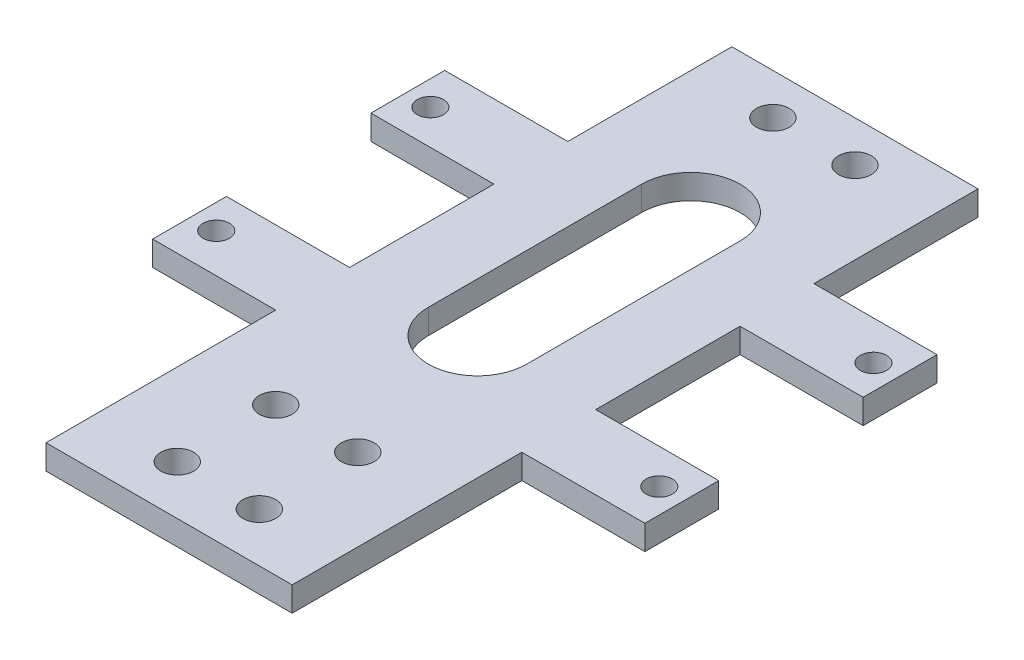
ISO-10303-21;
HEADER;
FILE_DESCRIPTION(('STEP AP214'),'2;1');
FILE_NAME('part.step','',(''),(''),'','','');
FILE_SCHEMA(('AUTOMOTIVE_DESIGN { 1 0 10303 214 1 1 1 1 }'));
ENDSEC;
DATA;
#1=APPLICATION_CONTEXT('core data for automotive mechanical design processes');
#2=APPLICATION_PROTOCOL_DEFINITION('international standard','automotive_design',2000,#1);
#3=PRODUCT_CONTEXT('',#1,'mechanical');
#4=PRODUCT('Part','Part','',(#3));
#5=PRODUCT_RELATED_PRODUCT_CATEGORY('part','',(#4));
#6=PRODUCT_DEFINITION_FORMATION('','',#4);
#7=PRODUCT_DEFINITION_CONTEXT('part definition',#1,'design');
#8=PRODUCT_DEFINITION('design','',#6,#7);
#9=PRODUCT_DEFINITION_SHAPE('','',#8);
#10=(LENGTH_UNIT() NAMED_UNIT(*) SI_UNIT(.MILLI.,.METRE.));
#11=(NAMED_UNIT(*) PLANE_ANGLE_UNIT() SI_UNIT($,.RADIAN.));
#12=(NAMED_UNIT(*) SI_UNIT($,.STERADIAN.) SOLID_ANGLE_UNIT());
#13=UNCERTAINTY_MEASURE_WITH_UNIT(LENGTH_MEASURE(1.E-05),#10,'distance_accuracy_value','');
#14=(GEOMETRIC_REPRESENTATION_CONTEXT(3) GLOBAL_UNCERTAINTY_ASSIGNED_CONTEXT((#13)) GLOBAL_UNIT_ASSIGNED_CONTEXT((#10,
#11,#12)) REPRESENTATION_CONTEXT('',''));
#15=CARTESIAN_POINT('',(0.,0.,0.));
#16=DIRECTION('',(0.,0.,1.));
#17=DIRECTION('',(1.,0.,0.));
#18=AXIS2_PLACEMENT_3D('',#15,#16,#17);
#19=CARTESIAN_POINT('',(0.,3.,0.));
#20=DIRECTION('',(1.,0.,0.));
#21=DIRECTION('',(0.,0.,-1.));
#22=AXIS2_PLACEMENT_3D('',#19,#20,#21);
#23=PLANE('',#22);
#24=DIRECTION('',(0.,0.,1.));
#25=VECTOR('',#24,1.);
#26=CARTESIAN_POINT('',(0.,0.,0.));
#27=LINE('',#26,#25);
#28=CARTESIAN_POINT('',(0.,0.,-9.));
#29=VERTEX_POINT('',#28);
#30=CARTESIAN_POINT('',(0.,0.,0.));
#31=VERTEX_POINT('',#30);
#32=EDGE_CURVE('E289',#29,#31,#27,.T.);
#33=ORIENTED_EDGE('',*,*,#32,.T.);
#34=DIRECTION('',(0.,-1.,0.));
#35=VECTOR('',#34,1.);
#36=CARTESIAN_POINT('',(0.,3.,0.));
#37=LINE('',#36,#35);
#38=CARTESIAN_POINT('',(0.,3.,0.));
#39=VERTEX_POINT('',#38);
#40=EDGE_CURVE('E11',#39,#31,#37,.T.);
#41=ORIENTED_EDGE('',*,*,#40,.F.);
#42=DIRECTION('',(0.,0.,1.));
#43=VECTOR('',#42,1.);
#44=CARTESIAN_POINT('',(0.,3.,0.));
#45=LINE('',#44,#43);
#46=CARTESIAN_POINT('',(0.,3.,-9.));
#47=VERTEX_POINT('',#46);
#48=EDGE_CURVE('E292',#47,#39,#45,.T.);
#49=ORIENTED_EDGE('',*,*,#48,.F.);
#50=DIRECTION('',(0.,-1.,0.));
#51=VECTOR('',#50,1.);
#52=CARTESIAN_POINT('',(0.,3.,-9.));
#53=LINE('',#52,#51);
#54=EDGE_CURVE('E334',#47,#29,#53,.T.);
#55=ORIENTED_EDGE('',*,*,#54,.T.);
#56=EDGE_LOOP('',(#33,#41,#49,#55));
#57=FACE_BOUND('',#56,.T.);
#58=ADVANCED_FACE('F35',(#57),#23,.F.);
#59=CARTESIAN_POINT('',(0.,3.,0.));
#60=DIRECTION('',(0.,0.,-1.));
#61=DIRECTION('',(-1.,0.,0.));
#62=AXIS2_PLACEMENT_3D('',#59,#60,#61);
#63=PLANE('',#62);
#64=DIRECTION('',(1.,0.,0.));
#65=VECTOR('',#64,1.);
#66=CARTESIAN_POINT('',(0.,0.,0.));
#67=LINE('',#66,#65);
#68=CARTESIAN_POINT('',(15.,0.,0.));
#69=VERTEX_POINT('',#68);
#70=EDGE_CURVE('E337',#31,#69,#67,.T.);
#71=ORIENTED_EDGE('',*,*,#70,.T.);
#72=DIRECTION('',(0.,-1.,0.));
#73=VECTOR('',#72,1.);
#74=CARTESIAN_POINT('',(15.,3.,0.));
#75=LINE('',#74,#73);
#76=CARTESIAN_POINT('',(15.,3.,0.));
#77=VERTEX_POINT('',#76);
#78=EDGE_CURVE('E42',#77,#69,#75,.T.);
#79=ORIENTED_EDGE('',*,*,#78,.F.);
#80=DIRECTION('',(1.,0.,0.));
#81=VECTOR('',#80,1.);
#82=CARTESIAN_POINT('',(0.,3.,0.));
#83=LINE('',#82,#81);
#84=EDGE_CURVE('E295',#39,#77,#83,.T.);
#85=ORIENTED_EDGE('',*,*,#84,.F.);
#86=ORIENTED_EDGE('',*,*,#40,.T.);
#87=EDGE_LOOP('',(#71,#79,#85,#86));
#88=FACE_BOUND('',#87,.T.);
#89=ADVANCED_FACE('F453',(#88),#63,.F.);
#90=CARTESIAN_POINT('',(15.,3.,0.));
#91=DIRECTION('',(1.,0.,0.));
#92=DIRECTION('',(0.,0.,-1.));
#93=AXIS2_PLACEMENT_3D('',#90,#91,#92);
#94=PLANE('',#93);
#95=DIRECTION('',(0.,0.,1.));
#96=VECTOR('',#95,1.);
#97=CARTESIAN_POINT('',(15.,0.,0.));
#98=LINE('',#97,#96);
#99=CARTESIAN_POINT('',(15.,0.,28.));
#100=VERTEX_POINT('',#99);
#101=EDGE_CURVE('E339',#69,#100,#98,.T.);
#102=ORIENTED_EDGE('',*,*,#101,.T.);
#103=DIRECTION('',(0.,-1.,0.));
#104=VECTOR('',#103,1.);
#105=CARTESIAN_POINT('',(15.,3.,28.));
#106=LINE('',#105,#104);
#107=CARTESIAN_POINT('',(15.,3.,28.));
#108=VERTEX_POINT('',#107);
#109=EDGE_CURVE('E424',#108,#100,#106,.T.);
#110=ORIENTED_EDGE('',*,*,#109,.F.);
#111=DIRECTION('',(0.,0.,1.));
#112=VECTOR('',#111,1.);
#113=CARTESIAN_POINT('',(15.,3.,0.));
#114=LINE('',#113,#112);
#115=EDGE_CURVE('E298',#77,#108,#114,.T.);
#116=ORIENTED_EDGE('',*,*,#115,.F.);
#117=ORIENTED_EDGE('',*,*,#78,.T.);
#118=EDGE_LOOP('',(#102,#110,#116,#117));
#119=FACE_BOUND('',#118,.T.);
#120=ADVANCED_FACE('F431',(#119),#94,.F.);
#121=CARTESIAN_POINT('',(45.,3.,28.));
#122=DIRECTION('',(0.,0.,-1.));
#123=DIRECTION('',(-1.,0.,0.));
#124=AXIS2_PLACEMENT_3D('',#121,#122,#123);
#125=PLANE('',#124);
#126=DIRECTION('',(1.,0.,0.));
#127=VECTOR('',#126,1.);
#128=CARTESIAN_POINT('',(45.,0.,28.));
#129=LINE('',#128,#127);
#130=CARTESIAN_POINT('',(45.,0.,28.));
#131=VERTEX_POINT('',#130);
#132=EDGE_CURVE('E341',#100,#131,#129,.T.);
#133=ORIENTED_EDGE('',*,*,#132,.T.);
#134=DIRECTION('',(0.,-1.,0.));
#135=VECTOR('',#134,1.);
#136=CARTESIAN_POINT('',(45.,3.,28.));
#137=LINE('',#136,#135);
#138=CARTESIAN_POINT('',(45.,3.,28.));
#139=VERTEX_POINT('',#138);
#140=EDGE_CURVE('E421',#139,#131,#137,.T.);
#141=ORIENTED_EDGE('',*,*,#140,.F.);
#142=DIRECTION('',(1.,0.,0.));
#143=VECTOR('',#142,1.);
#144=CARTESIAN_POINT('',(45.,3.,28.));
#145=LINE('',#144,#143);
#146=EDGE_CURVE('E300',#108,#139,#145,.T.);
#147=ORIENTED_EDGE('',*,*,#146,.F.);
#148=ORIENTED_EDGE('',*,*,#109,.T.);
#149=EDGE_LOOP('',(#133,#141,#147,#148));
#150=FACE_BOUND('',#149,.T.);
#151=ADVANCED_FACE('F441',(#150),#125,.F.);
#152=CARTESIAN_POINT('',(45.,3.,0.));
#153=DIRECTION('',(-1.,0.,0.));
#154=DIRECTION('',(0.,0.,1.));
#155=AXIS2_PLACEMENT_3D('',#152,#153,#154);
#156=PLANE('',#155);
#157=DIRECTION('',(0.,0.,-1.));
#158=VECTOR('',#157,1.);
#159=CARTESIAN_POINT('',(45.,0.,0.));
#160=LINE('',#159,#158);
#161=CARTESIAN_POINT('',(45.,0.,0.));
#162=VERTEX_POINT('',#161);
#163=EDGE_CURVE('E343',#131,#162,#160,.T.);
#164=ORIENTED_EDGE('',*,*,#163,.T.);
#165=DIRECTION('',(0.,-1.,0.));
#166=VECTOR('',#165,1.);
#167=CARTESIAN_POINT('',(45.,3.,0.));
#168=LINE('',#167,#166);
#169=CARTESIAN_POINT('',(45.,3.,0.));
#170=VERTEX_POINT('',#169);
#171=EDGE_CURVE('E418',#170,#162,#168,.T.);
#172=ORIENTED_EDGE('',*,*,#171,.F.);
#173=DIRECTION('',(0.,0.,-1.));
#174=VECTOR('',#173,1.);
#175=CARTESIAN_POINT('',(45.,3.,0.));
#176=LINE('',#175,#174);
#177=EDGE_CURVE('E302',#139,#170,#176,.T.);
#178=ORIENTED_EDGE('',*,*,#177,.F.);
#179=ORIENTED_EDGE('',*,*,#140,.T.);
#180=EDGE_LOOP('',(#164,#172,#178,#179));
#181=FACE_BOUND('',#180,.T.);
#182=ADVANCED_FACE('F445',(#181),#156,.F.);
#183=CARTESIAN_POINT('',(60.,3.,0.));
#184=DIRECTION('',(0.,0.,-1.));
#185=DIRECTION('',(-1.,0.,0.));
#186=AXIS2_PLACEMENT_3D('',#183,#184,#185);
#187=PLANE('',#186);
#188=DIRECTION('',(1.,0.,0.));
#189=VECTOR('',#188,1.);
#190=CARTESIAN_POINT('',(60.,0.,0.));
#191=LINE('',#190,#189);
#192=CARTESIAN_POINT('',(60.,0.,0.));
#193=VERTEX_POINT('',#192);
#194=EDGE_CURVE('E345',#162,#193,#191,.T.);
#195=ORIENTED_EDGE('',*,*,#194,.T.);
#196=DIRECTION('',(0.,-1.,0.));
#197=VECTOR('',#196,1.);
#198=CARTESIAN_POINT('',(60.,3.,0.));
#199=LINE('',#198,#197);
#200=CARTESIAN_POINT('',(60.,3.,0.));
#201=VERTEX_POINT('',#200);
#202=EDGE_CURVE('E415',#201,#193,#199,.T.);
#203=ORIENTED_EDGE('',*,*,#202,.F.);
#204=DIRECTION('',(1.,0.,0.));
#205=VECTOR('',#204,1.);
#206=CARTESIAN_POINT('',(60.,3.,0.));
#207=LINE('',#206,#205);
#208=EDGE_CURVE('E304',#170,#201,#207,.T.);
#209=ORIENTED_EDGE('',*,*,#208,.F.);
#210=ORIENTED_EDGE('',*,*,#171,.T.);
#211=EDGE_LOOP('',(#195,#203,#209,#210));
#212=FACE_BOUND('',#211,.T.);
#213=ADVANCED_FACE('F526',(#212),#187,.F.);
#214=CARTESIAN_POINT('',(60.,3.,-9.));
#215=DIRECTION('',(-1.,0.,0.));
#216=DIRECTION('',(0.,0.,1.));
#217=AXIS2_PLACEMENT_3D('',#214,#215,#216);
#218=PLANE('',#217);
#219=DIRECTION('',(0.,0.,-1.));
#220=VECTOR('',#219,1.);
#221=CARTESIAN_POINT('',(60.,0.,-9.));
#222=LINE('',#221,#220);
#223=CARTESIAN_POINT('',(60.,0.,-9.));
#224=VERTEX_POINT('',#223);
#225=EDGE_CURVE('E347',#193,#224,#222,.T.);
#226=ORIENTED_EDGE('',*,*,#225,.T.);
#227=DIRECTION('',(0.,-1.,0.));
#228=VECTOR('',#227,1.);
#229=CARTESIAN_POINT('',(60.,3.,-9.));
#230=LINE('',#229,#228);
#231=CARTESIAN_POINT('',(60.,3.,-9.));
#232=VERTEX_POINT('',#231);
#233=EDGE_CURVE('E412',#232,#224,#230,.T.);
#234=ORIENTED_EDGE('',*,*,#233,.F.);
#235=DIRECTION('',(0.,0.,-1.));
#236=VECTOR('',#235,1.);
#237=CARTESIAN_POINT('',(60.,3.,-9.));
#238=LINE('',#237,#236);
#239=EDGE_CURVE('E306',#201,#232,#238,.T.);
#240=ORIENTED_EDGE('',*,*,#239,.F.);
#241=ORIENTED_EDGE('',*,*,#202,.T.);
#242=EDGE_LOOP('',(#226,#234,#240,#241));
#243=FACE_BOUND('',#242,.T.);
#244=ADVANCED_FACE('F524',(#243),#218,.F.);
#245=CARTESIAN_POINT('',(45.,3.,-9.));
#246=DIRECTION('',(0.,0.,1.));
#247=DIRECTION('',(1.,0.,0.));
#248=AXIS2_PLACEMENT_3D('',#245,#246,#247);
#249=PLANE('',#248);
#250=DIRECTION('',(-1.,0.,0.));
#251=VECTOR('',#250,1.);
#252=CARTESIAN_POINT('',(45.,0.,-9.));
#253=LINE('',#252,#251);
#254=CARTESIAN_POINT('',(45.,0.,-9.));
#255=VERTEX_POINT('',#254);
#256=EDGE_CURVE('E349',#224,#255,#253,.T.);
#257=ORIENTED_EDGE('',*,*,#256,.T.);
#258=DIRECTION('',(0.,-1.,0.));
#259=VECTOR('',#258,1.);
#260=CARTESIAN_POINT('',(45.,3.,-9.));
#261=LINE('',#260,#259);
#262=CARTESIAN_POINT('',(45.,3.,-9.));
#263=VERTEX_POINT('',#262);
#264=EDGE_CURVE('E409',#263,#255,#261,.T.);
#265=ORIENTED_EDGE('',*,*,#264,.F.);
#266=DIRECTION('',(-1.,0.,0.));
#267=VECTOR('',#266,1.);
#268=CARTESIAN_POINT('',(45.,3.,-9.));
#269=LINE('',#268,#267);
#270=EDGE_CURVE('E308',#232,#263,#269,.T.);
#271=ORIENTED_EDGE('',*,*,#270,.F.);
#272=ORIENTED_EDGE('',*,*,#233,.T.);
#273=EDGE_LOOP('',(#257,#265,#271,#272));
#274=FACE_BOUND('',#273,.T.);
#275=ADVANCED_FACE('F519',(#274),#249,.F.);
#276=CARTESIAN_POINT('',(45.,3.,-26.6));
#277=DIRECTION('',(-1.,0.,0.));
#278=DIRECTION('',(0.,0.,1.));
#279=AXIS2_PLACEMENT_3D('',#276,#277,#278);
#280=PLANE('',#279);
#281=DIRECTION('',(0.,0.,-1.));
#282=VECTOR('',#281,1.);
#283=CARTESIAN_POINT('',(45.,0.,-26.6));
#284=LINE('',#283,#282);
#285=CARTESIAN_POINT('',(45.,0.,-26.6));
#286=VERTEX_POINT('',#285);
#287=EDGE_CURVE('E351',#255,#286,#284,.T.);
#288=ORIENTED_EDGE('',*,*,#287,.T.);
#289=DIRECTION('',(0.,-1.,0.));
#290=VECTOR('',#289,1.);
#291=CARTESIAN_POINT('',(45.,3.,-26.6));
#292=LINE('',#291,#290);
#293=CARTESIAN_POINT('',(45.,3.,-26.6));
#294=VERTEX_POINT('',#293);
#295=EDGE_CURVE('E406',#294,#286,#292,.T.);
#296=ORIENTED_EDGE('',*,*,#295,.F.);
#297=DIRECTION('',(0.,0.,-1.));
#298=VECTOR('',#297,1.);
#299=CARTESIAN_POINT('',(45.,3.,-26.6));
#300=LINE('',#299,#298);
#301=EDGE_CURVE('E310',#263,#294,#300,.T.);
#302=ORIENTED_EDGE('',*,*,#301,.F.);
#303=ORIENTED_EDGE('',*,*,#264,.T.);
#304=EDGE_LOOP('',(#288,#296,#302,#303));
#305=FACE_BOUND('',#304,.T.);
#306=ADVANCED_FACE('F514',(#305),#280,.F.);
#307=CARTESIAN_POINT('',(60.,3.,-26.6));
#308=DIRECTION('',(0.,0.,-1.));
#309=DIRECTION('',(-1.,0.,0.));
#310=AXIS2_PLACEMENT_3D('',#307,#308,#309);
#311=PLANE('',#310);
#312=DIRECTION('',(1.,0.,0.));
#313=VECTOR('',#312,1.);
#314=CARTESIAN_POINT('',(60.,0.,-26.6));
#315=LINE('',#314,#313);
#316=CARTESIAN_POINT('',(60.,0.,-26.6));
#317=VERTEX_POINT('',#316);
#318=EDGE_CURVE('E353',#286,#317,#315,.T.);
#319=ORIENTED_EDGE('',*,*,#318,.T.);
#320=DIRECTION('',(0.,-1.,0.));
#321=VECTOR('',#320,1.);
#322=CARTESIAN_POINT('',(60.,3.,-26.6));
#323=LINE('',#322,#321);
#324=CARTESIAN_POINT('',(60.,3.,-26.6));
#325=VERTEX_POINT('',#324);
#326=EDGE_CURVE('E403',#325,#317,#323,.T.);
#327=ORIENTED_EDGE('',*,*,#326,.F.);
#328=DIRECTION('',(1.,0.,0.));
#329=VECTOR('',#328,1.);
#330=CARTESIAN_POINT('',(60.,3.,-26.6));
#331=LINE('',#330,#329);
#332=EDGE_CURVE('E312',#294,#325,#331,.T.);
#333=ORIENTED_EDGE('',*,*,#332,.F.);
#334=ORIENTED_EDGE('',*,*,#295,.T.);
#335=EDGE_LOOP('',(#319,#327,#333,#334));
#336=FACE_BOUND('',#335,.T.);
#337=ADVANCED_FACE('F510',(#336),#311,.F.);
#338=CARTESIAN_POINT('',(60.,3.,-35.6));
#339=DIRECTION('',(-1.,0.,0.));
#340=DIRECTION('',(0.,0.,1.));
#341=AXIS2_PLACEMENT_3D('',#338,#339,#340);
#342=PLANE('',#341);
#343=DIRECTION('',(0.,0.,-1.));
#344=VECTOR('',#343,1.);
#345=CARTESIAN_POINT('',(60.,0.,-35.6));
#346=LINE('',#345,#344);
#347=CARTESIAN_POINT('',(60.,0.,-35.6));
#348=VERTEX_POINT('',#347);
#349=EDGE_CURVE('E355',#317,#348,#346,.T.);
#350=ORIENTED_EDGE('',*,*,#349,.T.);
#351=DIRECTION('',(0.,-1.,0.));
#352=VECTOR('',#351,1.);
#353=CARTESIAN_POINT('',(60.,3.,-35.6));
#354=LINE('',#353,#352);
#355=CARTESIAN_POINT('',(60.,3.,-35.6));
#356=VERTEX_POINT('',#355);
#357=EDGE_CURVE('E400',#356,#348,#354,.T.);
#358=ORIENTED_EDGE('',*,*,#357,.F.);
#359=DIRECTION('',(0.,0.,-1.));
#360=VECTOR('',#359,1.);
#361=CARTESIAN_POINT('',(60.,3.,-35.6));
#362=LINE('',#361,#360);
#363=EDGE_CURVE('E314',#325,#356,#362,.T.);
#364=ORIENTED_EDGE('',*,*,#363,.F.);
#365=ORIENTED_EDGE('',*,*,#326,.T.);
#366=EDGE_LOOP('',(#350,#358,#364,#365));
#367=FACE_BOUND('',#366,.T.);
#368=ADVANCED_FACE('F505',(#367),#342,.F.);
#369=CARTESIAN_POINT('',(45.,3.,-35.6));
#370=DIRECTION('',(0.,0.,1.));
#371=DIRECTION('',(1.,0.,0.));
#372=AXIS2_PLACEMENT_3D('',#369,#370,#371);
#373=PLANE('',#372);
#374=DIRECTION('',(-1.,0.,0.));
#375=VECTOR('',#374,1.);
#376=CARTESIAN_POINT('',(45.,0.,-35.6));
#377=LINE('',#376,#375);
#378=CARTESIAN_POINT('',(45.,0.,-35.6));
#379=VERTEX_POINT('',#378);
#380=EDGE_CURVE('E357',#348,#379,#377,.T.);
#381=ORIENTED_EDGE('',*,*,#380,.T.);
#382=DIRECTION('',(0.,-1.,0.));
#383=VECTOR('',#382,1.);
#384=CARTESIAN_POINT('',(45.,3.,-35.6));
#385=LINE('',#384,#383);
#386=CARTESIAN_POINT('',(45.,3.,-35.6));
#387=VERTEX_POINT('',#386);
#388=EDGE_CURVE('E397',#387,#379,#385,.T.);
#389=ORIENTED_EDGE('',*,*,#388,.F.);
#390=DIRECTION('',(-1.,0.,0.));
#391=VECTOR('',#390,1.);
#392=CARTESIAN_POINT('',(45.,3.,-35.6));
#393=LINE('',#392,#391);
#394=EDGE_CURVE('E316',#356,#387,#393,.T.);
#395=ORIENTED_EDGE('',*,*,#394,.F.);
#396=ORIENTED_EDGE('',*,*,#357,.T.);
#397=EDGE_LOOP('',(#381,#389,#395,#396));
#398=FACE_BOUND('',#397,.T.);
#399=ADVANCED_FACE('F499',(#398),#373,.F.);
#400=CARTESIAN_POINT('',(45.,3.,-55.6));
#401=DIRECTION('',(-1.,0.,0.));
#402=DIRECTION('',(0.,0.,1.));
#403=AXIS2_PLACEMENT_3D('',#400,#401,#402);
#404=PLANE('',#403);
#405=DIRECTION('',(0.,0.,-1.));
#406=VECTOR('',#405,1.);
#407=CARTESIAN_POINT('',(45.,0.,-55.6));
#408=LINE('',#407,#406);
#409=CARTESIAN_POINT('',(45.,0.,-55.6));
#410=VERTEX_POINT('',#409);
#411=EDGE_CURVE('E359',#379,#410,#408,.T.);
#412=ORIENTED_EDGE('',*,*,#411,.T.);
#413=DIRECTION('',(0.,-1.,0.));
#414=VECTOR('',#413,1.);
#415=CARTESIAN_POINT('',(45.,3.,-55.6));
#416=LINE('',#415,#414);
#417=CARTESIAN_POINT('',(45.,3.,-55.6));
#418=VERTEX_POINT('',#417);
#419=EDGE_CURVE('E394',#418,#410,#416,.T.);
#420=ORIENTED_EDGE('',*,*,#419,.F.);
#421=DIRECTION('',(0.,0.,-1.));
#422=VECTOR('',#421,1.);
#423=CARTESIAN_POINT('',(45.,3.,-55.6));
#424=LINE('',#423,#422);
#425=EDGE_CURVE('E318',#387,#418,#424,.T.);
#426=ORIENTED_EDGE('',*,*,#425,.F.);
#427=ORIENTED_EDGE('',*,*,#388,.T.);
#428=EDGE_LOOP('',(#412,#420,#426,#427));
#429=FACE_BOUND('',#428,.T.);
#430=ADVANCED_FACE('F495',(#429),#404,.F.);
#431=CARTESIAN_POINT('',(15.,3.,-55.6));
#432=DIRECTION('',(0.,0.,1.));
#433=DIRECTION('',(1.,0.,0.));
#434=AXIS2_PLACEMENT_3D('',#431,#432,#433);
#435=PLANE('',#434);
#436=DIRECTION('',(-1.,0.,0.));
#437=VECTOR('',#436,1.);
#438=CARTESIAN_POINT('',(15.,0.,-55.6));
#439=LINE('',#438,#437);
#440=CARTESIAN_POINT('',(15.,0.,-55.6));
#441=VERTEX_POINT('',#440);
#442=EDGE_CURVE('E361',#410,#441,#439,.T.);
#443=ORIENTED_EDGE('',*,*,#442,.T.);
#444=DIRECTION('',(0.,-1.,0.));
#445=VECTOR('',#444,1.);
#446=CARTESIAN_POINT('',(15.,3.,-55.6));
#447=LINE('',#446,#445);
#448=CARTESIAN_POINT('',(15.,3.,-55.6));
#449=VERTEX_POINT('',#448);
#450=EDGE_CURVE('E391',#449,#441,#447,.T.);
#451=ORIENTED_EDGE('',*,*,#450,.F.);
#452=DIRECTION('',(-1.,0.,0.));
#453=VECTOR('',#452,1.);
#454=CARTESIAN_POINT('',(15.,3.,-55.6));
#455=LINE('',#454,#453);
#456=EDGE_CURVE('E320',#418,#449,#455,.T.);
#457=ORIENTED_EDGE('',*,*,#456,.F.);
#458=ORIENTED_EDGE('',*,*,#419,.T.);
#459=EDGE_LOOP('',(#443,#451,#457,#458));
#460=FACE_BOUND('',#459,.T.);
#461=ADVANCED_FACE('F490',(#460),#435,.F.);
#462=CARTESIAN_POINT('',(15.,3.,-35.6));
#463=DIRECTION('',(1.,0.,0.));
#464=DIRECTION('',(0.,0.,-1.));
#465=AXIS2_PLACEMENT_3D('',#462,#463,#464);
#466=PLANE('',#465);
#467=DIRECTION('',(0.,0.,1.));
#468=VECTOR('',#467,1.);
#469=CARTESIAN_POINT('',(15.,0.,-35.6));
#470=LINE('',#469,#468);
#471=CARTESIAN_POINT('',(15.,0.,-35.6));
#472=VERTEX_POINT('',#471);
#473=EDGE_CURVE('E363',#441,#472,#470,.T.);
#474=ORIENTED_EDGE('',*,*,#473,.T.);
#475=DIRECTION('',(0.,-1.,0.));
#476=VECTOR('',#475,1.);
#477=CARTESIAN_POINT('',(15.,3.,-35.6));
#478=LINE('',#477,#476);
#479=CARTESIAN_POINT('',(15.,3.,-35.6));
#480=VERTEX_POINT('',#479);
#481=EDGE_CURVE('E388',#480,#472,#478,.T.);
#482=ORIENTED_EDGE('',*,*,#481,.F.);
#483=DIRECTION('',(0.,0.,1.));
#484=VECTOR('',#483,1.);
#485=CARTESIAN_POINT('',(15.,3.,-35.6));
#486=LINE('',#485,#484);
#487=EDGE_CURVE('E322',#449,#480,#486,.T.);
#488=ORIENTED_EDGE('',*,*,#487,.F.);
#489=ORIENTED_EDGE('',*,*,#450,.T.);
#490=EDGE_LOOP('',(#474,#482,#488,#489));
#491=FACE_BOUND('',#490,.T.);
#492=ADVANCED_FACE('F484',(#491),#466,.F.);
#493=CARTESIAN_POINT('',(0.,3.,-35.6));
#494=DIRECTION('',(0.,0.,1.));
#495=DIRECTION('',(1.,0.,0.));
#496=AXIS2_PLACEMENT_3D('',#493,#494,#495);
#497=PLANE('',#496);
#498=DIRECTION('',(-1.,0.,0.));
#499=VECTOR('',#498,1.);
#500=CARTESIAN_POINT('',(0.,0.,-35.6));
#501=LINE('',#500,#499);
#502=CARTESIAN_POINT('',(0.,0.,-35.6));
#503=VERTEX_POINT('',#502);
#504=EDGE_CURVE('E365',#472,#503,#501,.T.);
#505=ORIENTED_EDGE('',*,*,#504,.T.);
#506=DIRECTION('',(0.,-1.,0.));
#507=VECTOR('',#506,1.);
#508=CARTESIAN_POINT('',(0.,3.,-35.6));
#509=LINE('',#508,#507);
#510=CARTESIAN_POINT('',(0.,3.,-35.6));
#511=VERTEX_POINT('',#510);
#512=EDGE_CURVE('E385',#511,#503,#509,.T.);
#513=ORIENTED_EDGE('',*,*,#512,.F.);
#514=DIRECTION('',(-1.,0.,0.));
#515=VECTOR('',#514,1.);
#516=CARTESIAN_POINT('',(0.,3.,-35.6));
#517=LINE('',#516,#515);
#518=EDGE_CURVE('E324',#480,#511,#517,.T.);
#519=ORIENTED_EDGE('',*,*,#518,.F.);
#520=ORIENTED_EDGE('',*,*,#481,.T.);
#521=EDGE_LOOP('',(#505,#513,#519,#520));
#522=FACE_BOUND('',#521,.T.);
#523=ADVANCED_FACE('F480',(#522),#497,.F.);
#524=CARTESIAN_POINT('',(0.,3.,-26.6));
#525=DIRECTION('',(1.,0.,0.));
#526=DIRECTION('',(0.,0.,-1.));
#527=AXIS2_PLACEMENT_3D('',#524,#525,#526);
#528=PLANE('',#527);
#529=DIRECTION('',(0.,0.,1.));
#530=VECTOR('',#529,1.);
#531=CARTESIAN_POINT('',(0.,0.,-26.6));
#532=LINE('',#531,#530);
#533=CARTESIAN_POINT('',(0.,0.,-26.6));
#534=VERTEX_POINT('',#533);
#535=EDGE_CURVE('E367',#503,#534,#532,.T.);
#536=ORIENTED_EDGE('',*,*,#535,.T.);
#537=DIRECTION('',(0.,-1.,0.));
#538=VECTOR('',#537,1.);
#539=CARTESIAN_POINT('',(0.,3.,-26.6));
#540=LINE('',#539,#538);
#541=CARTESIAN_POINT('',(0.,3.,-26.6));
#542=VERTEX_POINT('',#541);
#543=EDGE_CURVE('E382',#542,#534,#540,.T.);
#544=ORIENTED_EDGE('',*,*,#543,.F.);
#545=DIRECTION('',(0.,0.,1.));
#546=VECTOR('',#545,1.);
#547=CARTESIAN_POINT('',(0.,3.,-26.6));
#548=LINE('',#547,#546);
#549=EDGE_CURVE('E326',#511,#542,#548,.T.);
#550=ORIENTED_EDGE('',*,*,#549,.F.);
#551=ORIENTED_EDGE('',*,*,#512,.T.);
#552=EDGE_LOOP('',(#536,#544,#550,#551));
#553=FACE_BOUND('',#552,.T.);
#554=ADVANCED_FACE('F475',(#553),#528,.F.);
#555=CARTESIAN_POINT('',(15.,3.,-26.6));
#556=DIRECTION('',(0.,0.,-1.));
#557=DIRECTION('',(-1.,0.,0.));
#558=AXIS2_PLACEMENT_3D('',#555,#556,#557);
#559=PLANE('',#558);
#560=DIRECTION('',(1.,0.,0.));
#561=VECTOR('',#560,1.);
#562=CARTESIAN_POINT('',(15.,0.,-26.6));
#563=LINE('',#562,#561);
#564=CARTESIAN_POINT('',(15.,0.,-26.6));
#565=VERTEX_POINT('',#564);
#566=EDGE_CURVE('E369',#534,#565,#563,.T.);
#567=ORIENTED_EDGE('',*,*,#566,.T.);
#568=DIRECTION('',(0.,-1.,0.));
#569=VECTOR('',#568,1.);
#570=CARTESIAN_POINT('',(15.,3.,-26.6));
#571=LINE('',#570,#569);
#572=CARTESIAN_POINT('',(15.,3.,-26.6));
#573=VERTEX_POINT('',#572);
#574=EDGE_CURVE('E379',#573,#565,#571,.T.);
#575=ORIENTED_EDGE('',*,*,#574,.F.);
#576=DIRECTION('',(1.,0.,0.));
#577=VECTOR('',#576,1.);
#578=CARTESIAN_POINT('',(15.,3.,-26.6));
#579=LINE('',#578,#577);
#580=EDGE_CURVE('E328',#542,#573,#579,.T.);
#581=ORIENTED_EDGE('',*,*,#580,.F.);
#582=ORIENTED_EDGE('',*,*,#543,.T.);
#583=EDGE_LOOP('',(#567,#575,#581,#582));
#584=FACE_BOUND('',#583,.T.);
#585=ADVANCED_FACE('F469',(#584),#559,.F.);
#586=CARTESIAN_POINT('',(15.,3.,-9.));
#587=DIRECTION('',(1.,0.,0.));
#588=DIRECTION('',(0.,0.,-1.));
#589=AXIS2_PLACEMENT_3D('',#586,#587,#588);
#590=PLANE('',#589);
#591=DIRECTION('',(0.,0.,1.));
#592=VECTOR('',#591,1.);
#593=CARTESIAN_POINT('',(15.,0.,-9.));
#594=LINE('',#593,#592);
#595=CARTESIAN_POINT('',(15.,0.,-9.));
#596=VERTEX_POINT('',#595);
#597=EDGE_CURVE('E371',#565,#596,#594,.T.);
#598=ORIENTED_EDGE('',*,*,#597,.T.);
#599=DIRECTION('',(0.,-1.,0.));
#600=VECTOR('',#599,1.);
#601=CARTESIAN_POINT('',(15.,3.,-9.));
#602=LINE('',#601,#600);
#603=CARTESIAN_POINT('',(15.,3.,-9.));
#604=VERTEX_POINT('',#603);
#605=EDGE_CURVE('E376',#604,#596,#602,.T.);
#606=ORIENTED_EDGE('',*,*,#605,.F.);
#607=DIRECTION('',(0.,0.,1.));
#608=VECTOR('',#607,1.);
#609=CARTESIAN_POINT('',(15.,3.,-9.));
#610=LINE('',#609,#608);
#611=EDGE_CURVE('E330',#573,#604,#610,.T.);
#612=ORIENTED_EDGE('',*,*,#611,.F.);
#613=ORIENTED_EDGE('',*,*,#574,.T.);
#614=EDGE_LOOP('',(#598,#606,#612,#613));
#615=FACE_BOUND('',#614,.T.);
#616=ADVANCED_FACE('F465',(#615),#590,.F.);
#617=CARTESIAN_POINT('',(0.,3.,-9.));
#618=DIRECTION('',(0.,0.,1.));
#619=DIRECTION('',(1.,0.,0.));
#620=AXIS2_PLACEMENT_3D('',#617,#618,#619);
#621=PLANE('',#620);
#622=DIRECTION('',(-1.,0.,0.));
#623=VECTOR('',#622,1.);
#624=CARTESIAN_POINT('',(0.,0.,-9.));
#625=LINE('',#624,#623);
#626=EDGE_CURVE('E296',#596,#29,#625,.T.);
#627=ORIENTED_EDGE('',*,*,#626,.T.);
#628=ORIENTED_EDGE('',*,*,#54,.F.);
#629=DIRECTION('',(-1.,0.,0.));
#630=VECTOR('',#629,1.);
#631=CARTESIAN_POINT('',(0.,3.,-9.));
#632=LINE('',#631,#630);
#633=EDGE_CURVE('E332',#604,#47,#632,.T.);
#634=ORIENTED_EDGE('',*,*,#633,.F.);
#635=ORIENTED_EDGE('',*,*,#605,.T.);
#636=EDGE_LOOP('',(#627,#628,#634,#635));
#637=FACE_BOUND('',#636,.T.);
#638=ADVANCED_FACE('F460',(#637),#621,.F.);
#639=CARTESIAN_POINT('',(0.,3.,0.));
#640=DIRECTION('',(0.,-1.,0.));
#641=DIRECTION('',(0.,0.,-1.));
#642=AXIS2_PLACEMENT_3D('',#639,#640,#641);
#643=PLANE('',#642);
#644=DIRECTION('',(0.,0.,1.));
#645=VECTOR('',#644,1.);
#646=CARTESIAN_POINT('',(24.,3.,-35.6));
#647=LINE('',#646,#645);
#648=CARTESIAN_POINT('',(24.,3.,-35.6));
#649=VERTEX_POINT('',#648);
#650=CARTESIAN_POINT('',(24.,3.,-9.60000000000001));
#651=VERTEX_POINT('',#650);
#652=EDGE_CURVE('E222',#649,#651,#647,.T.);
#653=ORIENTED_EDGE('',*,*,#652,.F.);
#654=CARTESIAN_POINT('',(30.,3.,-35.6));
#655=DIRECTION('',(0.,1.,0.));
#656=DIRECTION('',(0.,0.,1.));
#657=AXIS2_PLACEMENT_3D('',#654,#655,#656);
#658=CIRCLE('',#657,5.99999999999999);
#659=CARTESIAN_POINT('',(36.,3.,-35.6));
#660=VERTEX_POINT('',#659);
#661=EDGE_CURVE('E49',#660,#649,#658,.T.);
#662=ORIENTED_EDGE('',*,*,#661,.F.);
#663=DIRECTION('',(0.,0.,-1.));
#664=VECTOR('',#663,1.);
#665=CARTESIAN_POINT('',(36.,3.,-35.6));
#666=LINE('',#665,#664);
#667=CARTESIAN_POINT('',(36.,3.,-9.60000000000001));
#668=VERTEX_POINT('',#667);
#669=EDGE_CURVE('E213',#668,#660,#666,.T.);
#670=ORIENTED_EDGE('',*,*,#669,.F.);
#671=CARTESIAN_POINT('',(30.,3.,-9.60000000000001));
#672=DIRECTION('',(0.,1.,0.));
#673=DIRECTION('',(0.,0.,1.));
#674=AXIS2_PLACEMENT_3D('',#671,#672,#673);
#675=CIRCLE('',#674,6.);
#676=EDGE_CURVE('E216',#651,#668,#675,.T.);
#677=ORIENTED_EDGE('',*,*,#676,.F.);
#678=EDGE_LOOP('',(#653,#662,#670,#677));
#679=FACE_BOUND('',#678,.T.);
#680=CARTESIAN_POINT('',(35.,3.,-50.6));
#681=DIRECTION('',(0.,1.,0.));
#682=DIRECTION('',(0.,0.,1.));
#683=AXIS2_PLACEMENT_3D('',#680,#681,#682);
#684=CIRCLE('',#683,2.);
#685=CARTESIAN_POINT('',(35.,3.,-48.6));
#686=VERTEX_POINT('',#685);
#687=EDGE_CURVE('E242',#686,#686,#684,.T.);
#688=ORIENTED_EDGE('',*,*,#687,.F.);
#689=EDGE_LOOP('',(#688));
#690=FACE_BOUND('',#689,.T.);
#691=CARTESIAN_POINT('',(35.,3.,22.));
#692=DIRECTION('',(0.,1.,0.));
#693=DIRECTION('',(0.,0.,1.));
#694=AXIS2_PLACEMENT_3D('',#691,#692,#693);
#695=CIRCLE('',#694,2.);
#696=CARTESIAN_POINT('',(35.,3.,24.));
#697=VERTEX_POINT('',#696);
#698=EDGE_CURVE('E248',#697,#697,#695,.T.);
#699=ORIENTED_EDGE('',*,*,#698,.F.);
#700=EDGE_LOOP('',(#699));
#701=FACE_BOUND('',#700,.T.);
#702=CARTESIAN_POINT('',(25.,3.,22.));
#703=DIRECTION('',(0.,1.,0.));
#704=DIRECTION('',(0.,0.,1.));
#705=AXIS2_PLACEMENT_3D('',#702,#703,#704);
#706=CIRCLE('',#705,2.);
#707=CARTESIAN_POINT('',(25.,3.,24.));
#708=VERTEX_POINT('',#707);
#709=EDGE_CURVE('E254',#708,#708,#706,.T.);
#710=ORIENTED_EDGE('',*,*,#709,.F.);
#711=EDGE_LOOP('',(#710));
#712=FACE_BOUND('',#711,.T.);
#713=CARTESIAN_POINT('',(25.,3.,10.));
#714=DIRECTION('',(0.,1.,0.));
#715=DIRECTION('',(0.,0.,1.));
#716=AXIS2_PLACEMENT_3D('',#713,#714,#715);
#717=CIRCLE('',#716,2.);
#718=CARTESIAN_POINT('',(25.,3.,12.));
#719=VERTEX_POINT('',#718);
#720=EDGE_CURVE('E235',#719,#719,#717,.T.);
#721=ORIENTED_EDGE('',*,*,#720,.F.);
#722=EDGE_LOOP('',(#721));
#723=FACE_BOUND('',#722,.T.);
#724=CARTESIAN_POINT('',(35.,3.,10.));
#725=DIRECTION('',(0.,1.,0.));
#726=DIRECTION('',(0.,0.,1.));
#727=AXIS2_PLACEMENT_3D('',#724,#725,#726);
#728=CIRCLE('',#727,2.);
#729=CARTESIAN_POINT('',(35.,3.,12.));
#730=VERTEX_POINT('',#729);
#731=EDGE_CURVE('E228',#730,#730,#728,.T.);
#732=ORIENTED_EDGE('',*,*,#731,.F.);
#733=EDGE_LOOP('',(#732));
#734=FACE_BOUND('',#733,.T.);
#735=CARTESIAN_POINT('',(25.,3.,-50.6));
#736=DIRECTION('',(0.,1.,0.));
#737=DIRECTION('',(0.,0.,1.));
#738=AXIS2_PLACEMENT_3D('',#735,#736,#737);
#739=CIRCLE('',#738,2.00000000000001);
#740=CARTESIAN_POINT('',(25.,3.,-48.6));
#741=VERTEX_POINT('',#740);
#742=EDGE_CURVE('E241',#741,#741,#739,.T.);
#743=ORIENTED_EDGE('',*,*,#742,.F.);
#744=EDGE_LOOP('',(#743));
#745=FACE_BOUND('',#744,.T.);
#746=CARTESIAN_POINT('',(57.,3.,-4.75));
#747=DIRECTION('',(0.,1.,0.));
#748=DIRECTION('',(0.,0.,1.));
#749=AXIS2_PLACEMENT_3D('',#746,#747,#748);
#750=CIRCLE('',#749,1.6);
#751=CARTESIAN_POINT('',(57.,3.,-3.15));
#752=VERTEX_POINT('',#751);
#753=EDGE_CURVE('E265',#752,#752,#750,.T.);
#754=ORIENTED_EDGE('',*,*,#753,.F.);
#755=EDGE_LOOP('',(#754));
#756=FACE_BOUND('',#755,.T.);
#757=CARTESIAN_POINT('',(57.,3.,-30.85));
#758=DIRECTION('',(0.,1.,0.));
#759=DIRECTION('',(0.,0.,1.));
#760=AXIS2_PLACEMENT_3D('',#757,#758,#759);
#761=CIRCLE('',#760,1.6);
#762=CARTESIAN_POINT('',(57.,3.,-29.25));
#763=VERTEX_POINT('',#762);
#764=EDGE_CURVE('E278',#763,#763,#761,.T.);
#765=ORIENTED_EDGE('',*,*,#764,.F.);
#766=EDGE_LOOP('',(#765));
#767=FACE_BOUND('',#766,.T.);
#768=CARTESIAN_POINT('',(3.,3.,-30.85));
#769=DIRECTION('',(0.,1.,0.));
#770=DIRECTION('',(0.,0.,1.));
#771=AXIS2_PLACEMENT_3D('',#768,#769,#770);
#772=CIRCLE('',#771,1.6);
#773=CARTESIAN_POINT('',(3.,3.,-29.25));
#774=VERTEX_POINT('',#773);
#775=EDGE_CURVE('E272',#774,#774,#772,.T.);
#776=ORIENTED_EDGE('',*,*,#775,.F.);
#777=EDGE_LOOP('',(#776));
#778=FACE_BOUND('',#777,.T.);
#779=CARTESIAN_POINT('',(3.,3.,-4.75));
#780=DIRECTION('',(0.,1.,0.));
#781=DIRECTION('',(0.,0.,1.));
#782=AXIS2_PLACEMENT_3D('',#779,#780,#781);
#783=CIRCLE('',#782,1.6);
#784=CARTESIAN_POINT('',(3.,3.,-3.15));
#785=VERTEX_POINT('',#784);
#786=EDGE_CURVE('E271',#785,#785,#783,.T.);
#787=ORIENTED_EDGE('',*,*,#786,.F.);
#788=EDGE_LOOP('',(#787));
#789=FACE_BOUND('',#788,.T.);
#790=ORIENTED_EDGE('',*,*,#48,.T.);
#791=ORIENTED_EDGE('',*,*,#84,.T.);
#792=ORIENTED_EDGE('',*,*,#115,.T.);
#793=ORIENTED_EDGE('',*,*,#146,.T.);
#794=ORIENTED_EDGE('',*,*,#177,.T.);
#795=ORIENTED_EDGE('',*,*,#208,.T.);
#796=ORIENTED_EDGE('',*,*,#239,.T.);
#797=ORIENTED_EDGE('',*,*,#270,.T.);
#798=ORIENTED_EDGE('',*,*,#301,.T.);
#799=ORIENTED_EDGE('',*,*,#332,.T.);
#800=ORIENTED_EDGE('',*,*,#363,.T.);
#801=ORIENTED_EDGE('',*,*,#394,.T.);
#802=ORIENTED_EDGE('',*,*,#425,.T.);
#803=ORIENTED_EDGE('',*,*,#456,.T.);
#804=ORIENTED_EDGE('',*,*,#487,.T.);
#805=ORIENTED_EDGE('',*,*,#518,.T.);
#806=ORIENTED_EDGE('',*,*,#549,.T.);
#807=ORIENTED_EDGE('',*,*,#580,.T.);
#808=ORIENTED_EDGE('',*,*,#611,.T.);
#809=ORIENTED_EDGE('',*,*,#633,.T.);
#810=EDGE_LOOP('',(#790,#791,#792,#793,#794,#795,#796,#797,#798,#799,#800,#801,#802,#803,#804,
#805,#806,#807,#808,#809));
#811=FACE_BOUND('',#810,.T.);
#812=ADVANCED_FACE('F449',(#679,#690,#701,#712,#723,#734,#745,#756,#767,#778,#789,#811),#643,.F.);
#813=CARTESIAN_POINT('',(0.,0.,0.));
#814=DIRECTION('',(0.,-1.,0.));
#815=DIRECTION('',(0.,0.,-1.));
#816=AXIS2_PLACEMENT_3D('',#813,#814,#815);
#817=PLANE('',#816);
#818=CARTESIAN_POINT('',(30.,0.,-35.6));
#819=DIRECTION('',(0.,1.,0.));
#820=DIRECTION('',(0.,0.,1.));
#821=AXIS2_PLACEMENT_3D('',#818,#819,#820);
#822=CIRCLE('',#821,5.99999999999999);
#823=CARTESIAN_POINT('',(36.,0.,-35.6));
#824=VERTEX_POINT('',#823);
#825=CARTESIAN_POINT('',(24.,0.,-35.6));
#826=VERTEX_POINT('',#825);
#827=EDGE_CURVE('E197',#824,#826,#822,.T.);
#828=ORIENTED_EDGE('',*,*,#827,.T.);
#829=DIRECTION('',(0.,0.,1.));
#830=VECTOR('',#829,1.);
#831=CARTESIAN_POINT('',(24.,0.,-35.6));
#832=LINE('',#831,#830);
#833=CARTESIAN_POINT('',(24.,0.,-9.60000000000001));
#834=VERTEX_POINT('',#833);
#835=EDGE_CURVE('E206',#826,#834,#832,.T.);
#836=ORIENTED_EDGE('',*,*,#835,.T.);
#837=CARTESIAN_POINT('',(30.,0.,-9.60000000000001));
#838=DIRECTION('',(0.,1.,0.));
#839=DIRECTION('',(0.,0.,1.));
#840=AXIS2_PLACEMENT_3D('',#837,#838,#839);
#841=CIRCLE('',#840,6.);
#842=CARTESIAN_POINT('',(36.,0.,-9.60000000000001));
#843=VERTEX_POINT('',#842);
#844=EDGE_CURVE('E57',#834,#843,#841,.T.);
#845=ORIENTED_EDGE('',*,*,#844,.T.);
#846=DIRECTION('',(0.,0.,-1.));
#847=VECTOR('',#846,1.);
#848=CARTESIAN_POINT('',(36.,0.,-35.6));
#849=LINE('',#848,#847);
#850=EDGE_CURVE('E203',#843,#824,#849,.T.);
#851=ORIENTED_EDGE('',*,*,#850,.T.);
#852=EDGE_LOOP('',(#828,#836,#845,#851));
#853=FACE_BOUND('',#852,.T.);
#854=CARTESIAN_POINT('',(35.,0.,-50.6));
#855=DIRECTION('',(0.,1.,0.));
#856=DIRECTION('',(0.,0.,1.));
#857=AXIS2_PLACEMENT_3D('',#854,#855,#856);
#858=CIRCLE('',#857,2.);
#859=CARTESIAN_POINT('',(35.,0.,-48.6));
#860=VERTEX_POINT('',#859);
#861=EDGE_CURVE('E238',#860,#860,#858,.T.);
#862=ORIENTED_EDGE('',*,*,#861,.T.);
#863=EDGE_LOOP('',(#862));
#864=FACE_BOUND('',#863,.T.);
#865=CARTESIAN_POINT('',(35.,0.,22.));
#866=DIRECTION('',(0.,1.,0.));
#867=DIRECTION('',(0.,0.,1.));
#868=AXIS2_PLACEMENT_3D('',#865,#866,#867);
#869=CIRCLE('',#868,2.);
#870=CARTESIAN_POINT('',(35.,0.,24.));
#871=VERTEX_POINT('',#870);
#872=EDGE_CURVE('E245',#871,#871,#869,.T.);
#873=ORIENTED_EDGE('',*,*,#872,.T.);
#874=EDGE_LOOP('',(#873));
#875=FACE_BOUND('',#874,.T.);
#876=CARTESIAN_POINT('',(25.,0.,22.));
#877=DIRECTION('',(0.,1.,0.));
#878=DIRECTION('',(0.,0.,1.));
#879=AXIS2_PLACEMENT_3D('',#876,#877,#878);
#880=CIRCLE('',#879,2.);
#881=CARTESIAN_POINT('',(25.,0.,24.));
#882=VERTEX_POINT('',#881);
#883=EDGE_CURVE('E251',#882,#882,#880,.T.);
#884=ORIENTED_EDGE('',*,*,#883,.T.);
#885=EDGE_LOOP('',(#884));
#886=FACE_BOUND('',#885,.T.);
#887=CARTESIAN_POINT('',(25.,0.,10.));
#888=DIRECTION('',(0.,1.,0.));
#889=DIRECTION('',(0.,0.,1.));
#890=AXIS2_PLACEMENT_3D('',#887,#888,#889);
#891=CIRCLE('',#890,2.);
#892=CARTESIAN_POINT('',(25.,0.,12.));
#893=VERTEX_POINT('',#892);
#894=EDGE_CURVE('E257',#893,#893,#891,.T.);
#895=ORIENTED_EDGE('',*,*,#894,.T.);
#896=EDGE_LOOP('',(#895));
#897=FACE_BOUND('',#896,.T.);
#898=CARTESIAN_POINT('',(35.,0.,10.));
#899=DIRECTION('',(0.,1.,0.));
#900=DIRECTION('',(0.,0.,1.));
#901=AXIS2_PLACEMENT_3D('',#898,#899,#900);
#902=CIRCLE('',#901,2.);
#903=CARTESIAN_POINT('',(35.,0.,12.));
#904=VERTEX_POINT('',#903);
#905=EDGE_CURVE('E232',#904,#904,#902,.T.);
#906=ORIENTED_EDGE('',*,*,#905,.T.);
#907=EDGE_LOOP('',(#906));
#908=FACE_BOUND('',#907,.T.);
#909=CARTESIAN_POINT('',(25.,0.,-50.6));
#910=DIRECTION('',(0.,1.,0.));
#911=DIRECTION('',(0.,0.,1.));
#912=AXIS2_PLACEMENT_3D('',#909,#910,#911);
#913=CIRCLE('',#912,2.00000000000001);
#914=CARTESIAN_POINT('',(25.,0.,-48.6));
#915=VERTEX_POINT('',#914);
#916=EDGE_CURVE('E262',#915,#915,#913,.T.);
#917=ORIENTED_EDGE('',*,*,#916,.T.);
#918=EDGE_LOOP('',(#917));
#919=FACE_BOUND('',#918,.T.);
#920=CARTESIAN_POINT('',(57.,0.,-4.75));
#921=DIRECTION('',(0.,1.,0.));
#922=DIRECTION('',(0.,0.,1.));
#923=AXIS2_PLACEMENT_3D('',#920,#921,#922);
#924=CIRCLE('',#923,1.6);
#925=CARTESIAN_POINT('',(57.,0.,-3.15));
#926=VERTEX_POINT('',#925);
#927=EDGE_CURVE('E281',#926,#926,#924,.T.);
#928=ORIENTED_EDGE('',*,*,#927,.T.);
#929=EDGE_LOOP('',(#928));
#930=FACE_BOUND('',#929,.T.);
#931=CARTESIAN_POINT('',(57.,0.,-30.85));
#932=DIRECTION('',(0.,1.,0.));
#933=DIRECTION('',(0.,0.,1.));
#934=AXIS2_PLACEMENT_3D('',#931,#932,#933);
#935=CIRCLE('',#934,1.6);
#936=CARTESIAN_POINT('',(57.,0.,-29.25));
#937=VERTEX_POINT('',#936);
#938=EDGE_CURVE('E275',#937,#937,#935,.T.);
#939=ORIENTED_EDGE('',*,*,#938,.T.);
#940=EDGE_LOOP('',(#939));
#941=FACE_BOUND('',#940,.T.);
#942=CARTESIAN_POINT('',(3.,0.,-30.85));
#943=DIRECTION('',(0.,1.,0.));
#944=DIRECTION('',(0.,0.,1.));
#945=AXIS2_PLACEMENT_3D('',#942,#943,#944);
#946=CIRCLE('',#945,1.6);
#947=CARTESIAN_POINT('',(3.,0.,-29.25));
#948=VERTEX_POINT('',#947);
#949=EDGE_CURVE('E268',#948,#948,#946,.T.);
#950=ORIENTED_EDGE('',*,*,#949,.T.);
#951=EDGE_LOOP('',(#950));
#952=FACE_BOUND('',#951,.T.);
#953=CARTESIAN_POINT('',(3.,0.,-4.75));
#954=DIRECTION('',(0.,1.,0.));
#955=DIRECTION('',(0.,0.,1.));
#956=AXIS2_PLACEMENT_3D('',#953,#954,#955);
#957=CIRCLE('',#956,1.6);
#958=CARTESIAN_POINT('',(3.,0.,-3.15));
#959=VERTEX_POINT('',#958);
#960=EDGE_CURVE('E286',#959,#959,#957,.T.);
#961=ORIENTED_EDGE('',*,*,#960,.T.);
#962=EDGE_LOOP('',(#961));
#963=FACE_BOUND('',#962,.T.);
#964=ORIENTED_EDGE('',*,*,#32,.F.);
#965=ORIENTED_EDGE('',*,*,#626,.F.);
#966=ORIENTED_EDGE('',*,*,#597,.F.);
#967=ORIENTED_EDGE('',*,*,#566,.F.);
#968=ORIENTED_EDGE('',*,*,#535,.F.);
#969=ORIENTED_EDGE('',*,*,#504,.F.);
#970=ORIENTED_EDGE('',*,*,#473,.F.);
#971=ORIENTED_EDGE('',*,*,#442,.F.);
#972=ORIENTED_EDGE('',*,*,#411,.F.);
#973=ORIENTED_EDGE('',*,*,#380,.F.);
#974=ORIENTED_EDGE('',*,*,#349,.F.);
#975=ORIENTED_EDGE('',*,*,#318,.F.);
#976=ORIENTED_EDGE('',*,*,#287,.F.);
#977=ORIENTED_EDGE('',*,*,#256,.F.);
#978=ORIENTED_EDGE('',*,*,#225,.F.);
#979=ORIENTED_EDGE('',*,*,#194,.F.);
#980=ORIENTED_EDGE('',*,*,#163,.F.);
#981=ORIENTED_EDGE('',*,*,#132,.F.);
#982=ORIENTED_EDGE('',*,*,#101,.F.);
#983=ORIENTED_EDGE('',*,*,#70,.F.);
#984=EDGE_LOOP('',(#964,#965,#966,#967,#968,#969,#970,#971,#972,#973,#974,#975,#976,#977,#978,
#979,#980,#981,#982,#983));
#985=FACE_BOUND('',#984,.T.);
#986=ADVANCED_FACE('F210',(#853,#864,#875,#886,#897,#908,#919,#930,#941,#952,#963,#985),#817,.T.);
#987=CARTESIAN_POINT('',(3.,0.,-4.75));
#988=DIRECTION('',(0.,1.,0.));
#989=DIRECTION('',(0.,0.,1.));
#990=AXIS2_PLACEMENT_3D('',#987,#988,#989);
#991=CYLINDRICAL_SURFACE('',#990,1.6);
#992=ORIENTED_EDGE('',*,*,#960,.F.);
#993=EDGE_LOOP('',(#992));
#994=FACE_BOUND('',#993,.T.);
#995=ORIENTED_EDGE('',*,*,#786,.T.);
#996=EDGE_LOOP('',(#995));
#997=FACE_BOUND('',#996,.T.);
#998=ADVANCED_FACE('F674',(#994,#997),#991,.F.);
#999=CARTESIAN_POINT('',(3.,0.,-30.85));
#1000=DIRECTION('',(0.,1.,0.));
#1001=DIRECTION('',(0.,0.,1.));
#1002=AXIS2_PLACEMENT_3D('',#999,#1000,#1001);
#1003=CYLINDRICAL_SURFACE('',#1002,1.6);
#1004=ORIENTED_EDGE('',*,*,#949,.F.);
#1005=EDGE_LOOP('',(#1004));
#1006=FACE_BOUND('',#1005,.T.);
#1007=ORIENTED_EDGE('',*,*,#775,.T.);
#1008=EDGE_LOOP('',(#1007));
#1009=FACE_BOUND('',#1008,.T.);
#1010=ADVANCED_FACE('F679',(#1006,#1009),#1003,.F.);
#1011=CARTESIAN_POINT('',(57.,0.,-30.85));
#1012=DIRECTION('',(0.,1.,0.));
#1013=DIRECTION('',(0.,0.,1.));
#1014=AXIS2_PLACEMENT_3D('',#1011,#1012,#1013);
#1015=CYLINDRICAL_SURFACE('',#1014,1.6);
#1016=ORIENTED_EDGE('',*,*,#938,.F.);
#1017=EDGE_LOOP('',(#1016));
#1018=FACE_BOUND('',#1017,.T.);
#1019=ORIENTED_EDGE('',*,*,#764,.T.);
#1020=EDGE_LOOP('',(#1019));
#1021=FACE_BOUND('',#1020,.T.);
#1022=ADVANCED_FACE('F691',(#1018,#1021),#1015,.F.);
#1023=CARTESIAN_POINT('',(57.,0.,-4.75));
#1024=DIRECTION('',(0.,1.,0.));
#1025=DIRECTION('',(0.,0.,1.));
#1026=AXIS2_PLACEMENT_3D('',#1023,#1024,#1025);
#1027=CYLINDRICAL_SURFACE('',#1026,1.6);
#1028=ORIENTED_EDGE('',*,*,#927,.F.);
#1029=EDGE_LOOP('',(#1028));
#1030=FACE_BOUND('',#1029,.T.);
#1031=ORIENTED_EDGE('',*,*,#753,.T.);
#1032=EDGE_LOOP('',(#1031));
#1033=FACE_BOUND('',#1032,.T.);
#1034=ADVANCED_FACE('F701',(#1030,#1033),#1027,.F.);
#1035=CARTESIAN_POINT('',(25.,0.,-50.6));
#1036=DIRECTION('',(0.,1.,0.));
#1037=DIRECTION('',(0.,0.,1.));
#1038=AXIS2_PLACEMENT_3D('',#1035,#1036,#1037);
#1039=CYLINDRICAL_SURFACE('',#1038,2.00000000000001);
#1040=ORIENTED_EDGE('',*,*,#916,.F.);
#1041=EDGE_LOOP('',(#1040));
#1042=FACE_BOUND('',#1041,.T.);
#1043=ORIENTED_EDGE('',*,*,#742,.T.);
#1044=EDGE_LOOP('',(#1043));
#1045=FACE_BOUND('',#1044,.T.);
#1046=ADVANCED_FACE('F711',(#1042,#1045),#1039,.F.);
#1047=CARTESIAN_POINT('',(35.,0.,10.));
#1048=DIRECTION('',(0.,1.,0.));
#1049=DIRECTION('',(0.,0.,1.));
#1050=AXIS2_PLACEMENT_3D('',#1047,#1048,#1049);
#1051=CYLINDRICAL_SURFACE('',#1050,2.);
#1052=ORIENTED_EDGE('',*,*,#905,.F.);
#1053=EDGE_LOOP('',(#1052));
#1054=FACE_BOUND('',#1053,.T.);
#1055=ORIENTED_EDGE('',*,*,#731,.T.);
#1056=EDGE_LOOP('',(#1055));
#1057=FACE_BOUND('',#1056,.T.);
#1058=ADVANCED_FACE('F721',(#1054,#1057),#1051,.F.);
#1059=CARTESIAN_POINT('',(25.,0.,10.));
#1060=DIRECTION('',(0.,1.,0.));
#1061=DIRECTION('',(0.,0.,1.));
#1062=AXIS2_PLACEMENT_3D('',#1059,#1060,#1061);
#1063=CYLINDRICAL_SURFACE('',#1062,2.);
#1064=ORIENTED_EDGE('',*,*,#894,.F.);
#1065=EDGE_LOOP('',(#1064));
#1066=FACE_BOUND('',#1065,.T.);
#1067=ORIENTED_EDGE('',*,*,#720,.T.);
#1068=EDGE_LOOP('',(#1067));
#1069=FACE_BOUND('',#1068,.T.);
#1070=ADVANCED_FACE('F731',(#1066,#1069),#1063,.F.);
#1071=CARTESIAN_POINT('',(25.,0.,22.));
#1072=DIRECTION('',(0.,1.,0.));
#1073=DIRECTION('',(0.,0.,1.));
#1074=AXIS2_PLACEMENT_3D('',#1071,#1072,#1073);
#1075=CYLINDRICAL_SURFACE('',#1074,2.);
#1076=ORIENTED_EDGE('',*,*,#883,.F.);
#1077=EDGE_LOOP('',(#1076));
#1078=FACE_BOUND('',#1077,.T.);
#1079=ORIENTED_EDGE('',*,*,#709,.T.);
#1080=EDGE_LOOP('',(#1079));
#1081=FACE_BOUND('',#1080,.T.);
#1082=ADVANCED_FACE('F741',(#1078,#1081),#1075,.F.);
#1083=CARTESIAN_POINT('',(35.,0.,22.));
#1084=DIRECTION('',(0.,1.,0.));
#1085=DIRECTION('',(0.,0.,1.));
#1086=AXIS2_PLACEMENT_3D('',#1083,#1084,#1085);
#1087=CYLINDRICAL_SURFACE('',#1086,2.);
#1088=ORIENTED_EDGE('',*,*,#872,.F.);
#1089=EDGE_LOOP('',(#1088));
#1090=FACE_BOUND('',#1089,.T.);
#1091=ORIENTED_EDGE('',*,*,#698,.T.);
#1092=EDGE_LOOP('',(#1091));
#1093=FACE_BOUND('',#1092,.T.);
#1094=ADVANCED_FACE('F751',(#1090,#1093),#1087,.F.);
#1095=CARTESIAN_POINT('',(35.,0.,-50.6));
#1096=DIRECTION('',(0.,1.,0.));
#1097=DIRECTION('',(0.,0.,1.));
#1098=AXIS2_PLACEMENT_3D('',#1095,#1096,#1097);
#1099=CYLINDRICAL_SURFACE('',#1098,2.);
#1100=ORIENTED_EDGE('',*,*,#861,.F.);
#1101=EDGE_LOOP('',(#1100));
#1102=FACE_BOUND('',#1101,.T.);
#1103=ORIENTED_EDGE('',*,*,#687,.T.);
#1104=EDGE_LOOP('',(#1103));
#1105=FACE_BOUND('',#1104,.T.);
#1106=ADVANCED_FACE('F761',(#1102,#1105),#1099,.F.);
#1107=CARTESIAN_POINT('',(30.,0.,-35.6));
#1108=DIRECTION('',(0.,1.,0.));
#1109=DIRECTION('',(0.,0.,1.));
#1110=AXIS2_PLACEMENT_3D('',#1107,#1108,#1109);
#1111=CYLINDRICAL_SURFACE('',#1110,5.99999999999999);
#1112=ORIENTED_EDGE('',*,*,#661,.T.);
#1113=DIRECTION('',(0.,1.,0.));
#1114=VECTOR('',#1113,1.);
#1115=CARTESIAN_POINT('',(24.,0.,-35.6));
#1116=LINE('',#1115,#1114);
#1117=EDGE_CURVE('E193',#826,#649,#1116,.T.);
#1118=ORIENTED_EDGE('',*,*,#1117,.F.);
#1119=ORIENTED_EDGE('',*,*,#827,.F.);
#1120=DIRECTION('',(0.,1.,0.));
#1121=VECTOR('',#1120,1.);
#1122=CARTESIAN_POINT('',(36.,0.,-35.6));
#1123=LINE('',#1122,#1121);
#1124=EDGE_CURVE('E226',#824,#660,#1123,.T.);
#1125=ORIENTED_EDGE('',*,*,#1124,.T.);
#1126=EDGE_LOOP('',(#1112,#1118,#1119,#1125));
#1127=FACE_BOUND('',#1126,.T.);
#1128=ADVANCED_FACE('F195',(#1127),#1111,.F.);
#1129=CARTESIAN_POINT('',(36.,0.,-35.6));
#1130=DIRECTION('',(1.,0.,0.));
#1131=DIRECTION('',(0.,0.,-1.));
#1132=AXIS2_PLACEMENT_3D('',#1129,#1130,#1131);
#1133=PLANE('',#1132);
#1134=ORIENTED_EDGE('',*,*,#669,.T.);
#1135=ORIENTED_EDGE('',*,*,#1124,.F.);
#1136=ORIENTED_EDGE('',*,*,#850,.F.);
#1137=DIRECTION('',(0.,1.,0.));
#1138=VECTOR('',#1137,1.);
#1139=CARTESIAN_POINT('',(36.,0.,-9.60000000000001));
#1140=LINE('',#1139,#1138);
#1141=EDGE_CURVE('E229',#843,#668,#1140,.T.);
#1142=ORIENTED_EDGE('',*,*,#1141,.T.);
#1143=EDGE_LOOP('',(#1134,#1135,#1136,#1142));
#1144=FACE_BOUND('',#1143,.T.);
#1145=ADVANCED_FACE('F793',(#1144),#1133,.F.);
#1146=CARTESIAN_POINT('',(30.,0.,-9.60000000000001));
#1147=DIRECTION('',(0.,1.,0.));
#1148=DIRECTION('',(0.,0.,1.));
#1149=AXIS2_PLACEMENT_3D('',#1146,#1147,#1148);
#1150=CYLINDRICAL_SURFACE('',#1149,6.);
#1151=ORIENTED_EDGE('',*,*,#676,.T.);
#1152=ORIENTED_EDGE('',*,*,#1141,.F.);
#1153=ORIENTED_EDGE('',*,*,#844,.F.);
#1154=DIRECTION('',(0.,1.,0.));
#1155=VECTOR('',#1154,1.);
#1156=CARTESIAN_POINT('',(24.,0.,-9.60000000000001));
#1157=LINE('',#1156,#1155);
#1158=EDGE_CURVE('E202',#834,#651,#1157,.T.);
#1159=ORIENTED_EDGE('',*,*,#1158,.T.);
#1160=EDGE_LOOP('',(#1151,#1152,#1153,#1159));
#1161=FACE_BOUND('',#1160,.T.);
#1162=ADVANCED_FACE('F802',(#1161),#1150,.F.);
#1163=CARTESIAN_POINT('',(24.,0.,-35.6));
#1164=DIRECTION('',(-1.,0.,0.));
#1165=DIRECTION('',(0.,0.,1.));
#1166=AXIS2_PLACEMENT_3D('',#1163,#1164,#1165);
#1167=PLANE('',#1166);
#1168=ORIENTED_EDGE('',*,*,#652,.T.);
#1169=ORIENTED_EDGE('',*,*,#1158,.F.);
#1170=ORIENTED_EDGE('',*,*,#835,.F.);
#1171=ORIENTED_EDGE('',*,*,#1117,.T.);
#1172=EDGE_LOOP('',(#1168,#1169,#1170,#1171));
#1173=FACE_BOUND('',#1172,.T.);
#1174=ADVANCED_FACE('F207',(#1173),#1167,.F.);
#1175=CLOSED_SHELL('',(#58,#89,#120,#151,#182,#213,#244,#275,#306,#337,#368,#399,#430,#461,#492,
#523,#554,#585,#616,#638,#812,#986,#998,#1010,#1022,#1034,#1046,#1058,#1070,#1082,#1094,#1106,
#1128,#1145,#1162,#1174));
#1176=MANIFOLD_SOLID_BREP('B2',#1175);
#1177=ADVANCED_BREP_SHAPE_REPRESENTATION('',(#18,#1176),#14);
#1178=SHAPE_DEFINITION_REPRESENTATION(#9,#1177);
ENDSEC;
END-ISO-10303-21;
